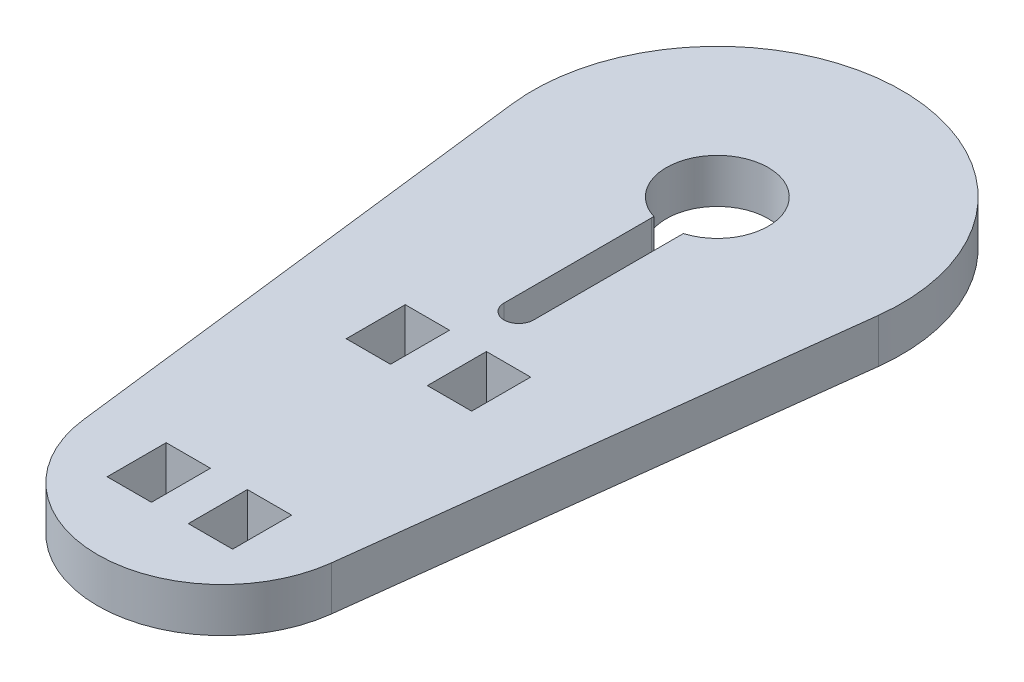
ISO-10303-21;
HEADER;
FILE_DESCRIPTION(('STEP AP214'),'2;1');
FILE_NAME('part.step','',(''),(''),'','','');
FILE_SCHEMA(('AUTOMOTIVE_DESIGN { 1 0 10303 214 1 1 1 1 }'));
ENDSEC;
DATA;
#1=APPLICATION_CONTEXT('core data for automotive mechanical design processes');
#2=APPLICATION_PROTOCOL_DEFINITION('international standard','automotive_design',2000,#1);
#3=PRODUCT_CONTEXT('',#1,'mechanical');
#4=PRODUCT('Part','Part','',(#3));
#5=PRODUCT_RELATED_PRODUCT_CATEGORY('part','',(#4));
#6=PRODUCT_DEFINITION_FORMATION('','',#4);
#7=PRODUCT_DEFINITION_CONTEXT('part definition',#1,'design');
#8=PRODUCT_DEFINITION('design','',#6,#7);
#9=PRODUCT_DEFINITION_SHAPE('','',#8);
#10=(LENGTH_UNIT() NAMED_UNIT(*) SI_UNIT(.MILLI.,.METRE.));
#11=(NAMED_UNIT(*) PLANE_ANGLE_UNIT() SI_UNIT($,.RADIAN.));
#12=(NAMED_UNIT(*) SI_UNIT($,.STERADIAN.) SOLID_ANGLE_UNIT());
#13=UNCERTAINTY_MEASURE_WITH_UNIT(LENGTH_MEASURE(1.E-05),#10,'distance_accuracy_value','');
#14=(GEOMETRIC_REPRESENTATION_CONTEXT(3) GLOBAL_UNCERTAINTY_ASSIGNED_CONTEXT((#13)) GLOBAL_UNIT_ASSIGNED_CONTEXT((#10,
#11,#12)) REPRESENTATION_CONTEXT('',''));
#15=CARTESIAN_POINT('',(0.,0.,0.));
#16=DIRECTION('',(0.,0.,1.));
#17=DIRECTION('',(1.,0.,0.));
#18=AXIS2_PLACEMENT_3D('',#15,#16,#17);
#19=CARTESIAN_POINT('',(0.,3.,33.5358925147265));
#20=DIRECTION('',(0.,-1.,0.));
#21=DIRECTION('',(0.,0.,-1.));
#22=AXIS2_PLACEMENT_3D('',#19,#20,#21);
#23=CYLINDRICAL_SURFACE('',#22,8.46410748527346);
#24=DIRECTION('',(0.,1.,0.));
#25=VECTOR('',#24,1.);
#26=CARTESIAN_POINT('',(8.40259097315382,3.,34.5545094496614));
#27=LINE('',#26,#25);
#28=CARTESIAN_POINT('',(8.40259097315382,3.,34.5545094496614));
#29=VERTEX_POINT('',#28);
#30=CARTESIAN_POINT('',(8.40259097315382,0.,34.5545094496614));
#31=VERTEX_POINT('',#30);
#32=EDGE_CURVE('E437',#29,#31,#27,.F.);
#33=ORIENTED_EDGE('',*,*,#32,.F.);
#34=CARTESIAN_POINT('',(0.,3.,33.5358925147265));
#35=DIRECTION('',(0.,1.,0.));
#36=DIRECTION('',(0.,0.,1.));
#37=AXIS2_PLACEMENT_3D('',#34,#35,#36);
#38=CIRCLE('',#37,8.46410748527346);
#39=CARTESIAN_POINT('',(-8.40259097315382,3.,34.5545094496614));
#40=VERTEX_POINT('',#39);
#41=EDGE_CURVE('E56',#40,#29,#38,.T.);
#42=ORIENTED_EDGE('',*,*,#41,.F.);
#43=DIRECTION('',(0.,-1.,0.));
#44=VECTOR('',#43,1.);
#45=CARTESIAN_POINT('',(-8.40259097315382,3.,34.5545094496614));
#46=LINE('',#45,#44);
#47=CARTESIAN_POINT('',(-8.40259097315382,0.,34.5545094496614));
#48=VERTEX_POINT('',#47);
#49=EDGE_CURVE('E499',#48,#40,#46,.F.);
#50=ORIENTED_EDGE('',*,*,#49,.F.);
#51=CARTESIAN_POINT('',(0.,0.,33.5358925147265));
#52=DIRECTION('',(0.,1.,0.));
#53=DIRECTION('',(0.,0.,1.));
#54=AXIS2_PLACEMENT_3D('',#51,#52,#53);
#55=CIRCLE('',#54,8.46410748527346);
#56=EDGE_CURVE('E12',#31,#48,#55,.F.);
#57=ORIENTED_EDGE('',*,*,#56,.F.);
#58=EDGE_LOOP('',(#33,#42,#50,#57));
#59=FACE_BOUND('',#58,.T.);
#60=ADVANCED_FACE('F47',(#59),#23,.T.);
#61=CARTESIAN_POINT('',(4.24999999999999,3.,0.));
#62=DIRECTION('',(1.,0.,0.));
#63=DIRECTION('',(0.,0.,-1.));
#64=AXIS2_PLACEMENT_3D('',#61,#62,#63);
#65=PLANE('',#64);
#66=DIRECTION('',(0.,0.,1.));
#67=VECTOR('',#66,1.);
#68=CARTESIAN_POINT('',(4.24999999999999,0.,0.));
#69=LINE('',#68,#67);
#70=CARTESIAN_POINT('',(4.25,0.,33.1));
#71=VERTEX_POINT('',#70);
#72=CARTESIAN_POINT('',(4.25,0.,37.1));
#73=VERTEX_POINT('',#72);
#74=EDGE_CURVE('E408',#71,#73,#69,.T.);
#75=ORIENTED_EDGE('',*,*,#74,.T.);
#76=DIRECTION('',(0.,-1.,0.));
#77=VECTOR('',#76,1.);
#78=CARTESIAN_POINT('',(4.25,3.,37.1));
#79=LINE('',#78,#77);
#80=CARTESIAN_POINT('',(4.25,3.,37.1));
#81=VERTEX_POINT('',#80);
#82=EDGE_CURVE('E433',#81,#73,#79,.T.);
#83=ORIENTED_EDGE('',*,*,#82,.F.);
#84=DIRECTION('',(0.,0.,1.));
#85=VECTOR('',#84,1.);
#86=CARTESIAN_POINT('',(4.24999999999999,3.,0.));
#87=LINE('',#86,#85);
#88=CARTESIAN_POINT('',(4.25,3.,33.1));
#89=VERTEX_POINT('',#88);
#90=EDGE_CURVE('E316',#89,#81,#87,.T.);
#91=ORIENTED_EDGE('',*,*,#90,.F.);
#92=DIRECTION('',(0.,-1.,0.));
#93=VECTOR('',#92,1.);
#94=CARTESIAN_POINT('',(4.25,3.,33.1));
#95=LINE('',#94,#93);
#96=EDGE_CURVE('E423',#89,#71,#95,.T.);
#97=ORIENTED_EDGE('',*,*,#96,.T.);
#98=EDGE_LOOP('',(#75,#83,#91,#97));
#99=FACE_BOUND('',#98,.T.);
#100=ADVANCED_FACE('F546',(#99),#65,.F.);
#101=CARTESIAN_POINT('',(0.,3.,37.1));
#102=DIRECTION('',(0.,0.,1.));
#103=DIRECTION('',(1.,0.,0.));
#104=AXIS2_PLACEMENT_3D('',#101,#102,#103);
#105=PLANE('',#104);
#106=DIRECTION('',(-1.,0.,0.));
#107=VECTOR('',#106,1.);
#108=CARTESIAN_POINT('',(0.,0.,37.1));
#109=LINE('',#108,#107);
#110=CARTESIAN_POINT('',(1.25,0.,37.1));
#111=VERTEX_POINT('',#110);
#112=EDGE_CURVE('E412',#73,#111,#109,.T.);
#113=ORIENTED_EDGE('',*,*,#112,.T.);
#114=DIRECTION('',(0.,-1.,0.));
#115=VECTOR('',#114,1.);
#116=CARTESIAN_POINT('',(1.25,3.,37.1));
#117=LINE('',#116,#115);
#118=CARTESIAN_POINT('',(1.25,3.,37.1));
#119=VERTEX_POINT('',#118);
#120=EDGE_CURVE('E430',#119,#111,#117,.T.);
#121=ORIENTED_EDGE('',*,*,#120,.F.);
#122=DIRECTION('',(-1.,0.,0.));
#123=VECTOR('',#122,1.);
#124=CARTESIAN_POINT('',(0.,3.,37.1));
#125=LINE('',#124,#123);
#126=EDGE_CURVE('E320',#81,#119,#125,.T.);
#127=ORIENTED_EDGE('',*,*,#126,.F.);
#128=ORIENTED_EDGE('',*,*,#82,.T.);
#129=EDGE_LOOP('',(#113,#121,#127,#128));
#130=FACE_BOUND('',#129,.T.);
#131=ADVANCED_FACE('F545',(#130),#105,.F.);
#132=CARTESIAN_POINT('',(1.25,3.,0.));
#133=DIRECTION('',(1.,0.,0.));
#134=DIRECTION('',(0.,0.,-1.));
#135=AXIS2_PLACEMENT_3D('',#132,#133,#134);
#136=PLANE('',#135);
#137=DIRECTION('',(0.,0.,1.));
#138=VECTOR('',#137,1.);
#139=CARTESIAN_POINT('',(1.25,0.,0.));
#140=LINE('',#139,#138);
#141=CARTESIAN_POINT('',(1.25,0.,33.1));
#142=VERTEX_POINT('',#141);
#143=EDGE_CURVE('E416',#142,#111,#140,.T.);
#144=ORIENTED_EDGE('',*,*,#143,.F.);
#145=DIRECTION('',(0.,-1.,0.));
#146=VECTOR('',#145,1.);
#147=CARTESIAN_POINT('',(1.25,3.,33.1));
#148=LINE('',#147,#146);
#149=CARTESIAN_POINT('',(1.25,3.,33.1));
#150=VERTEX_POINT('',#149);
#151=EDGE_CURVE('E426',#150,#142,#148,.T.);
#152=ORIENTED_EDGE('',*,*,#151,.F.);
#153=DIRECTION('',(0.,0.,1.));
#154=VECTOR('',#153,1.);
#155=CARTESIAN_POINT('',(1.25,3.,0.));
#156=LINE('',#155,#154);
#157=EDGE_CURVE('E323',#150,#119,#156,.T.);
#158=ORIENTED_EDGE('',*,*,#157,.T.);
#159=ORIENTED_EDGE('',*,*,#120,.T.);
#160=EDGE_LOOP('',(#144,#152,#158,#159));
#161=FACE_BOUND('',#160,.T.);
#162=ADVANCED_FACE('F542',(#161),#136,.T.);
#163=CARTESIAN_POINT('',(-1.25,3.,0.));
#164=DIRECTION('',(-1.,0.,0.));
#165=DIRECTION('',(0.,0.,1.));
#166=AXIS2_PLACEMENT_3D('',#163,#164,#165);
#167=PLANE('',#166);
#168=DIRECTION('',(0.,0.,-1.));
#169=VECTOR('',#168,1.);
#170=CARTESIAN_POINT('',(-1.25,0.,0.));
#171=LINE('',#170,#169);
#172=CARTESIAN_POINT('',(-1.25,0.,20.9));
#173=VERTEX_POINT('',#172);
#174=CARTESIAN_POINT('',(-1.25,0.,16.9));
#175=VERTEX_POINT('',#174);
#176=EDGE_CURVE('E392',#173,#175,#171,.T.);
#177=ORIENTED_EDGE('',*,*,#176,.F.);
#178=DIRECTION('',(0.,-1.,0.));
#179=VECTOR('',#178,1.);
#180=CARTESIAN_POINT('',(-1.25,3.,20.9));
#181=LINE('',#180,#179);
#182=CARTESIAN_POINT('',(-1.25,3.,20.9));
#183=VERTEX_POINT('',#182);
#184=EDGE_CURVE('E427',#183,#173,#181,.T.);
#185=ORIENTED_EDGE('',*,*,#184,.F.);
#186=DIRECTION('',(0.,0.,-1.));
#187=VECTOR('',#186,1.);
#188=CARTESIAN_POINT('',(-1.25,3.,0.));
#189=LINE('',#188,#187);
#190=CARTESIAN_POINT('',(-1.25,3.,16.9));
#191=VERTEX_POINT('',#190);
#192=EDGE_CURVE('E301',#183,#191,#189,.T.);
#193=ORIENTED_EDGE('',*,*,#192,.T.);
#194=DIRECTION('',(0.,-1.,0.));
#195=VECTOR('',#194,1.);
#196=CARTESIAN_POINT('',(-1.25,3.,16.9));
#197=LINE('',#196,#195);
#198=EDGE_CURVE('E438',#191,#175,#197,.T.);
#199=ORIENTED_EDGE('',*,*,#198,.T.);
#200=EDGE_LOOP('',(#177,#185,#193,#199));
#201=FACE_BOUND('',#200,.T.);
#202=ADVANCED_FACE('F580',(#201),#167,.T.);
#203=CARTESIAN_POINT('',(0.,3.,20.9));
#204=DIRECTION('',(0.,0.,-1.));
#205=DIRECTION('',(-1.,0.,0.));
#206=AXIS2_PLACEMENT_3D('',#203,#204,#205);
#207=PLANE('',#206);
#208=DIRECTION('',(1.,0.,0.));
#209=VECTOR('',#208,1.);
#210=CARTESIAN_POINT('',(0.,0.,20.9));
#211=LINE('',#210,#209);
#212=CARTESIAN_POINT('',(-4.25,0.,20.9));
#213=VERTEX_POINT('',#212);
#214=EDGE_CURVE('E396',#213,#173,#211,.T.);
#215=ORIENTED_EDGE('',*,*,#214,.F.);
#216=DIRECTION('',(0.,-1.,0.));
#217=VECTOR('',#216,1.);
#218=CARTESIAN_POINT('',(-4.25,3.,20.9));
#219=LINE('',#218,#217);
#220=CARTESIAN_POINT('',(-4.25,3.,20.9));
#221=VERTEX_POINT('',#220);
#222=EDGE_CURVE('E446',#221,#213,#219,.T.);
#223=ORIENTED_EDGE('',*,*,#222,.F.);
#224=DIRECTION('',(1.,0.,0.));
#225=VECTOR('',#224,1.);
#226=CARTESIAN_POINT('',(0.,3.,20.9));
#227=LINE('',#226,#225);
#228=EDGE_CURVE('E305',#221,#183,#227,.T.);
#229=ORIENTED_EDGE('',*,*,#228,.T.);
#230=ORIENTED_EDGE('',*,*,#184,.T.);
#231=EDGE_LOOP('',(#215,#223,#229,#230));
#232=FACE_BOUND('',#231,.T.);
#233=ADVANCED_FACE('F576',(#232),#207,.T.);
#234=CARTESIAN_POINT('',(-4.25,3.,0.));
#235=DIRECTION('',(-1.,0.,0.));
#236=DIRECTION('',(0.,0.,1.));
#237=AXIS2_PLACEMENT_3D('',#234,#235,#236);
#238=PLANE('',#237);
#239=DIRECTION('',(0.,0.,-1.));
#240=VECTOR('',#239,1.);
#241=CARTESIAN_POINT('',(-4.25,0.,0.));
#242=LINE('',#241,#240);
#243=CARTESIAN_POINT('',(-4.25,0.,16.9));
#244=VERTEX_POINT('',#243);
#245=EDGE_CURVE('E400',#213,#244,#242,.T.);
#246=ORIENTED_EDGE('',*,*,#245,.T.);
#247=DIRECTION('',(0.,-1.,0.));
#248=VECTOR('',#247,1.);
#249=CARTESIAN_POINT('',(-4.25,3.,16.9));
#250=LINE('',#249,#248);
#251=CARTESIAN_POINT('',(-4.25,3.,16.9));
#252=VERTEX_POINT('',#251);
#253=EDGE_CURVE('E441',#252,#244,#250,.T.);
#254=ORIENTED_EDGE('',*,*,#253,.F.);
#255=DIRECTION('',(0.,0.,-1.));
#256=VECTOR('',#255,1.);
#257=CARTESIAN_POINT('',(-4.25,3.,0.));
#258=LINE('',#257,#256);
#259=EDGE_CURVE('E309',#221,#252,#258,.T.);
#260=ORIENTED_EDGE('',*,*,#259,.F.);
#261=ORIENTED_EDGE('',*,*,#222,.T.);
#262=EDGE_LOOP('',(#246,#254,#260,#261));
#263=FACE_BOUND('',#262,.T.);
#264=ADVANCED_FACE('F572',(#263),#238,.F.);
#265=CARTESIAN_POINT('',(4.25,3.,0.));
#266=DIRECTION('',(-1.,0.,0.));
#267=DIRECTION('',(0.,0.,1.));
#268=AXIS2_PLACEMENT_3D('',#265,#266,#267);
#269=PLANE('',#268);
#270=DIRECTION('',(0.,0.,-1.));
#271=VECTOR('',#270,1.);
#272=CARTESIAN_POINT('',(4.25,0.,0.));
#273=LINE('',#272,#271);
#274=CARTESIAN_POINT('',(4.25,0.,20.9));
#275=VERTEX_POINT('',#274);
#276=CARTESIAN_POINT('',(4.25,0.,16.9));
#277=VERTEX_POINT('',#276);
#278=EDGE_CURVE('E376',#275,#277,#273,.T.);
#279=ORIENTED_EDGE('',*,*,#278,.F.);
#280=DIRECTION('',(0.,-1.,0.));
#281=VECTOR('',#280,1.);
#282=CARTESIAN_POINT('',(4.25,3.,20.9));
#283=LINE('',#282,#281);
#284=CARTESIAN_POINT('',(4.25,3.,20.9));
#285=VERTEX_POINT('',#284);
#286=EDGE_CURVE('E442',#285,#275,#283,.T.);
#287=ORIENTED_EDGE('',*,*,#286,.F.);
#288=DIRECTION('',(0.,0.,-1.));
#289=VECTOR('',#288,1.);
#290=CARTESIAN_POINT('',(4.25,3.,0.));
#291=LINE('',#290,#289);
#292=CARTESIAN_POINT('',(4.25,3.,16.9));
#293=VERTEX_POINT('',#292);
#294=EDGE_CURVE('E286',#285,#293,#291,.T.);
#295=ORIENTED_EDGE('',*,*,#294,.T.);
#296=DIRECTION('',(0.,-1.,0.));
#297=VECTOR('',#296,1.);
#298=CARTESIAN_POINT('',(4.25,3.,16.9));
#299=LINE('',#298,#297);
#300=EDGE_CURVE('E451',#293,#277,#299,.T.);
#301=ORIENTED_EDGE('',*,*,#300,.T.);
#302=EDGE_LOOP('',(#279,#287,#295,#301));
#303=FACE_BOUND('',#302,.T.);
#304=ADVANCED_FACE('F575',(#303),#269,.T.);
#305=CARTESIAN_POINT('',(0.,3.,20.9));
#306=DIRECTION('',(0.,0.,1.));
#307=DIRECTION('',(1.,0.,0.));
#308=AXIS2_PLACEMENT_3D('',#305,#306,#307);
#309=PLANE('',#308);
#310=DIRECTION('',(-1.,0.,0.));
#311=VECTOR('',#310,1.);
#312=CARTESIAN_POINT('',(0.,0.,20.9));
#313=LINE('',#312,#311);
#314=CARTESIAN_POINT('',(1.25,0.,20.9));
#315=VERTEX_POINT('',#314);
#316=EDGE_CURVE('E380',#275,#315,#313,.T.);
#317=ORIENTED_EDGE('',*,*,#316,.T.);
#318=DIRECTION('',(0.,-1.,0.));
#319=VECTOR('',#318,1.);
#320=CARTESIAN_POINT('',(1.25,3.,20.9));
#321=LINE('',#320,#319);
#322=CARTESIAN_POINT('',(1.25,3.,20.9));
#323=VERTEX_POINT('',#322);
#324=EDGE_CURVE('E458',#323,#315,#321,.T.);
#325=ORIENTED_EDGE('',*,*,#324,.F.);
#326=DIRECTION('',(-1.,0.,0.));
#327=VECTOR('',#326,1.);
#328=CARTESIAN_POINT('',(0.,3.,20.9));
#329=LINE('',#328,#327);
#330=EDGE_CURVE('E290',#285,#323,#329,.T.);
#331=ORIENTED_EDGE('',*,*,#330,.F.);
#332=ORIENTED_EDGE('',*,*,#286,.T.);
#333=EDGE_LOOP('',(#317,#325,#331,#332));
#334=FACE_BOUND('',#333,.T.);
#335=ADVANCED_FACE('F593',(#334),#309,.F.);
#336=CARTESIAN_POINT('',(1.25,3.,0.));
#337=DIRECTION('',(-1.,0.,0.));
#338=DIRECTION('',(0.,0.,1.));
#339=AXIS2_PLACEMENT_3D('',#336,#337,#338);
#340=PLANE('',#339);
#341=DIRECTION('',(0.,0.,-1.));
#342=VECTOR('',#341,1.);
#343=CARTESIAN_POINT('',(1.25,0.,0.));
#344=LINE('',#343,#342);
#345=CARTESIAN_POINT('',(1.25,0.,16.9));
#346=VERTEX_POINT('',#345);
#347=EDGE_CURVE('E384',#315,#346,#344,.T.);
#348=ORIENTED_EDGE('',*,*,#347,.T.);
#349=DIRECTION('',(0.,-1.,0.));
#350=VECTOR('',#349,1.);
#351=CARTESIAN_POINT('',(1.25,3.,16.9));
#352=LINE('',#351,#350);
#353=CARTESIAN_POINT('',(1.25,3.,16.9));
#354=VERTEX_POINT('',#353);
#355=EDGE_CURVE('E454',#354,#346,#352,.T.);
#356=ORIENTED_EDGE('',*,*,#355,.F.);
#357=DIRECTION('',(0.,0.,-1.));
#358=VECTOR('',#357,1.);
#359=CARTESIAN_POINT('',(1.25,3.,0.));
#360=LINE('',#359,#358);
#361=EDGE_CURVE('E294',#323,#354,#360,.T.);
#362=ORIENTED_EDGE('',*,*,#361,.F.);
#363=ORIENTED_EDGE('',*,*,#324,.T.);
#364=EDGE_LOOP('',(#348,#356,#362,#363));
#365=FACE_BOUND('',#364,.T.);
#366=ADVANCED_FACE('F589',(#365),#340,.F.);
#367=CARTESIAN_POINT('',(-4.24999999999999,3.,0.));
#368=DIRECTION('',(1.,0.,0.));
#369=DIRECTION('',(0.,0.,-1.));
#370=AXIS2_PLACEMENT_3D('',#367,#368,#369);
#371=PLANE('',#370);
#372=DIRECTION('',(0.,0.,1.));
#373=VECTOR('',#372,1.);
#374=CARTESIAN_POINT('',(-4.24999999999999,0.,0.));
#375=LINE('',#374,#373);
#376=CARTESIAN_POINT('',(-4.25,0.,33.1));
#377=VERTEX_POINT('',#376);
#378=CARTESIAN_POINT('',(-4.25,0.,37.1));
#379=VERTEX_POINT('',#378);
#380=EDGE_CURVE('E360',#377,#379,#375,.T.);
#381=ORIENTED_EDGE('',*,*,#380,.F.);
#382=DIRECTION('',(0.,-1.,0.));
#383=VECTOR('',#382,1.);
#384=CARTESIAN_POINT('',(-4.25,3.,33.1));
#385=LINE('',#384,#383);
#386=CARTESIAN_POINT('',(-4.25,3.,33.1));
#387=VERTEX_POINT('',#386);
#388=EDGE_CURVE('E455',#387,#377,#385,.T.);
#389=ORIENTED_EDGE('',*,*,#388,.F.);
#390=DIRECTION('',(0.,0.,1.));
#391=VECTOR('',#390,1.);
#392=CARTESIAN_POINT('',(-4.24999999999999,3.,0.));
#393=LINE('',#392,#391);
#394=CARTESIAN_POINT('',(-4.25,3.,37.1));
#395=VERTEX_POINT('',#394);
#396=EDGE_CURVE('E271',#387,#395,#393,.T.);
#397=ORIENTED_EDGE('',*,*,#396,.T.);
#398=DIRECTION('',(0.,-1.,0.));
#399=VECTOR('',#398,1.);
#400=CARTESIAN_POINT('',(-4.25,3.,37.1));
#401=LINE('',#400,#399);
#402=EDGE_CURVE('E464',#395,#379,#401,.T.);
#403=ORIENTED_EDGE('',*,*,#402,.T.);
#404=EDGE_LOOP('',(#381,#389,#397,#403));
#405=FACE_BOUND('',#404,.T.);
#406=ADVANCED_FACE('F592',(#405),#371,.T.);
#407=CARTESIAN_POINT('',(0.,3.,33.1));
#408=DIRECTION('',(0.,0.,-1.));
#409=DIRECTION('',(-1.,0.,0.));
#410=AXIS2_PLACEMENT_3D('',#407,#408,#409);
#411=PLANE('',#410);
#412=DIRECTION('',(1.,0.,0.));
#413=VECTOR('',#412,1.);
#414=CARTESIAN_POINT('',(0.,0.,33.1));
#415=LINE('',#414,#413);
#416=CARTESIAN_POINT('',(-1.25,0.,33.1));
#417=VERTEX_POINT('',#416);
#418=EDGE_CURVE('E364',#377,#417,#415,.T.);
#419=ORIENTED_EDGE('',*,*,#418,.T.);
#420=DIRECTION('',(0.,-1.,0.));
#421=VECTOR('',#420,1.);
#422=CARTESIAN_POINT('',(-1.25,3.,33.1));
#423=LINE('',#422,#421);
#424=CARTESIAN_POINT('',(-1.25,3.,33.1));
#425=VERTEX_POINT('',#424);
#426=EDGE_CURVE('E471',#425,#417,#423,.T.);
#427=ORIENTED_EDGE('',*,*,#426,.F.);
#428=DIRECTION('',(1.,0.,0.));
#429=VECTOR('',#428,1.);
#430=CARTESIAN_POINT('',(0.,3.,33.1));
#431=LINE('',#430,#429);
#432=EDGE_CURVE('E275',#387,#425,#431,.T.);
#433=ORIENTED_EDGE('',*,*,#432,.F.);
#434=ORIENTED_EDGE('',*,*,#388,.T.);
#435=EDGE_LOOP('',(#419,#427,#433,#434));
#436=FACE_BOUND('',#435,.T.);
#437=ADVANCED_FACE('F607',(#436),#411,.F.);
#438=CARTESIAN_POINT('',(-1.25,3.,0.));
#439=DIRECTION('',(1.,0.,0.));
#440=DIRECTION('',(0.,0.,-1.));
#441=AXIS2_PLACEMENT_3D('',#438,#439,#440);
#442=PLANE('',#441);
#443=DIRECTION('',(0.,0.,1.));
#444=VECTOR('',#443,1.);
#445=CARTESIAN_POINT('',(-1.25,0.,0.));
#446=LINE('',#445,#444);
#447=CARTESIAN_POINT('',(-1.25,0.,37.1));
#448=VERTEX_POINT('',#447);
#449=EDGE_CURVE('E368',#417,#448,#446,.T.);
#450=ORIENTED_EDGE('',*,*,#449,.T.);
#451=DIRECTION('',(0.,-1.,0.));
#452=VECTOR('',#451,1.);
#453=CARTESIAN_POINT('',(-1.25,3.,37.1));
#454=LINE('',#453,#452);
#455=CARTESIAN_POINT('',(-1.25,3.,37.1));
#456=VERTEX_POINT('',#455);
#457=EDGE_CURVE('E467',#456,#448,#454,.T.);
#458=ORIENTED_EDGE('',*,*,#457,.F.);
#459=DIRECTION('',(0.,0.,1.));
#460=VECTOR('',#459,1.);
#461=CARTESIAN_POINT('',(-1.25,3.,0.));
#462=LINE('',#461,#460);
#463=EDGE_CURVE('E279',#425,#456,#462,.T.);
#464=ORIENTED_EDGE('',*,*,#463,.F.);
#465=ORIENTED_EDGE('',*,*,#426,.T.);
#466=EDGE_LOOP('',(#450,#458,#464,#465));
#467=FACE_BOUND('',#466,.T.);
#468=ADVANCED_FACE('F604',(#467),#442,.F.);
#469=CARTESIAN_POINT('',(12.409150917231,3.,1.5043182885897));
#470=DIRECTION('',(-0.992732073378479,0.,-0.120345463087176));
#471=DIRECTION('',(-0.120345463087176,0.,0.992732073378479));
#472=AXIS2_PLACEMENT_3D('',#469,#470,#471);
#473=PLANE('',#472);
#474=DIRECTION('',(0.120345463087176,0.,-0.992732073378479));
#475=VECTOR('',#474,1.);
#476=CARTESIAN_POINT('',(12.409150917231,3.,1.5043182885897));
#477=LINE('',#476,#475);
#478=CARTESIAN_POINT('',(12.409150917231,3.,1.50431828858971));
#479=VERTEX_POINT('',#478);
#480=EDGE_CURVE('E261',#29,#479,#477,.T.);
#481=ORIENTED_EDGE('',*,*,#480,.F.);
#482=ORIENTED_EDGE('',*,*,#32,.T.);
#483=DIRECTION('',(0.120345463087176,0.,-0.992732073378479));
#484=VECTOR('',#483,1.);
#485=CARTESIAN_POINT('',(12.409150917231,0.,1.5043182885897));
#486=LINE('',#485,#484);
#487=CARTESIAN_POINT('',(12.409150917231,0.,1.50431828858971));
#488=VERTEX_POINT('',#487);
#489=EDGE_CURVE('E350',#31,#488,#486,.T.);
#490=ORIENTED_EDGE('',*,*,#489,.T.);
#491=DIRECTION('',(0.,-1.,0.));
#492=VECTOR('',#491,1.);
#493=CARTESIAN_POINT('',(12.409150917231,3.,1.50431828858971));
#494=LINE('',#493,#492);
#495=EDGE_CURVE('E468',#479,#488,#494,.T.);
#496=ORIENTED_EDGE('',*,*,#495,.F.);
#497=EDGE_LOOP('',(#481,#482,#490,#496));
#498=FACE_BOUND('',#497,.T.);
#499=ADVANCED_FACE('F508',(#498),#473,.F.);
#500=CARTESIAN_POINT('',(0.,3.,0.));
#501=DIRECTION('',(0.,-1.,0.));
#502=DIRECTION('',(0.,0.,-1.));
#503=AXIS2_PLACEMENT_3D('',#500,#501,#502);
#504=CYLINDRICAL_SURFACE('',#503,12.5);
#505=CARTESIAN_POINT('',(0.,0.,0.));
#506=DIRECTION('',(0.,1.,0.));
#507=DIRECTION('',(0.,0.,1.));
#508=AXIS2_PLACEMENT_3D('',#505,#506,#507);
#509=CIRCLE('',#508,12.5);
#510=CARTESIAN_POINT('',(-12.409150917231,0.,1.50431828858971));
#511=VERTEX_POINT('',#510);
#512=EDGE_CURVE('E353',#488,#511,#509,.T.);
#513=ORIENTED_EDGE('',*,*,#512,.T.);
#514=DIRECTION('',(0.,-1.,0.));
#515=VECTOR('',#514,1.);
#516=CARTESIAN_POINT('',(-12.409150917231,3.,1.50431828858971));
#517=LINE('',#516,#515);
#518=CARTESIAN_POINT('',(-12.409150917231,3.,1.50431828858971));
#519=VERTEX_POINT('',#518);
#520=EDGE_CURVE('E243',#519,#511,#517,.T.);
#521=ORIENTED_EDGE('',*,*,#520,.F.);
#522=CARTESIAN_POINT('',(0.,3.,0.));
#523=DIRECTION('',(0.,1.,0.));
#524=DIRECTION('',(0.,0.,1.));
#525=AXIS2_PLACEMENT_3D('',#522,#523,#524);
#526=CIRCLE('',#525,12.5);
#527=EDGE_CURVE('E264',#479,#519,#526,.T.);
#528=ORIENTED_EDGE('',*,*,#527,.F.);
#529=ORIENTED_EDGE('',*,*,#495,.T.);
#530=EDGE_LOOP('',(#513,#521,#528,#529));
#531=FACE_BOUND('',#530,.T.);
#532=ADVANCED_FACE('F511',(#531),#504,.T.);
#533=CARTESIAN_POINT('',(1.,3.,0.));
#534=DIRECTION('',(1.,0.,0.));
#535=DIRECTION('',(0.,0.,-1.));
#536=AXIS2_PLACEMENT_3D('',#533,#534,#535);
#537=PLANE('',#536);
#538=DIRECTION('',(0.,0.,1.));
#539=VECTOR('',#538,1.);
#540=CARTESIAN_POINT('',(1.,0.,0.));
#541=LINE('',#540,#539);
#542=CARTESIAN_POINT('',(1.,0.,3.45));
#543=VERTEX_POINT('',#542);
#544=CARTESIAN_POINT('',(1.,0.,13.45));
#545=VERTEX_POINT('',#544);
#546=EDGE_CURVE('E238',#543,#545,#541,.T.);
#547=ORIENTED_EDGE('',*,*,#546,.T.);
#548=DIRECTION('',(0.,-1.,0.));
#549=VECTOR('',#548,1.);
#550=CARTESIAN_POINT('',(1.,3.,13.45));
#551=LINE('',#550,#549);
#552=CARTESIAN_POINT('',(1.,3.,13.45));
#553=VERTEX_POINT('',#552);
#554=EDGE_CURVE('E235',#553,#545,#551,.T.);
#555=ORIENTED_EDGE('',*,*,#554,.F.);
#556=DIRECTION('',(0.,0.,1.));
#557=VECTOR('',#556,1.);
#558=CARTESIAN_POINT('',(1.,3.,0.));
#559=LINE('',#558,#557);
#560=CARTESIAN_POINT('',(1.,3.,3.45));
#561=VERTEX_POINT('',#560);
#562=EDGE_CURVE('E219',#561,#553,#559,.T.);
#563=ORIENTED_EDGE('',*,*,#562,.F.);
#564=DIRECTION('',(0.,-1.,0.));
#565=VECTOR('',#564,1.);
#566=CARTESIAN_POINT('',(1.,3.,3.45));
#567=LINE('',#566,#565);
#568=EDGE_CURVE('E331',#561,#543,#567,.T.);
#569=ORIENTED_EDGE('',*,*,#568,.T.);
#570=EDGE_LOOP('',(#547,#555,#563,#569));
#571=FACE_BOUND('',#570,.T.);
#572=ADVANCED_FACE('F236',(#571),#537,.F.);
#573=CARTESIAN_POINT('',(0.,3.,13.45));
#574=DIRECTION('',(0.,-1.,0.));
#575=DIRECTION('',(0.,0.,-1.));
#576=AXIS2_PLACEMENT_3D('',#573,#574,#575);
#577=CYLINDRICAL_SURFACE('',#576,1.);
#578=CARTESIAN_POINT('',(0.,0.,13.45));
#579=DIRECTION('',(0.,1.,0.));
#580=DIRECTION('',(0.,0.,1.));
#581=AXIS2_PLACEMENT_3D('',#578,#579,#580);
#582=CIRCLE('',#581,1.);
#583=CARTESIAN_POINT('',(-1.,0.,13.45));
#584=VERTEX_POINT('',#583);
#585=EDGE_CURVE('E334',#584,#545,#582,.T.);
#586=ORIENTED_EDGE('',*,*,#585,.F.);
#587=DIRECTION('',(0.,-1.,0.));
#588=VECTOR('',#587,1.);
#589=CARTESIAN_POINT('',(-1.,3.,13.45));
#590=LINE('',#589,#588);
#591=CARTESIAN_POINT('',(-1.,3.,13.45));
#592=VERTEX_POINT('',#591);
#593=EDGE_CURVE('E244',#592,#584,#590,.T.);
#594=ORIENTED_EDGE('',*,*,#593,.F.);
#595=CARTESIAN_POINT('',(0.,3.,13.45));
#596=DIRECTION('',(0.,1.,0.));
#597=DIRECTION('',(0.,0.,1.));
#598=AXIS2_PLACEMENT_3D('',#595,#596,#597);
#599=CIRCLE('',#598,1.);
#600=EDGE_CURVE('E225',#592,#553,#599,.T.);
#601=ORIENTED_EDGE('',*,*,#600,.T.);
#602=ORIENTED_EDGE('',*,*,#554,.T.);
#603=EDGE_LOOP('',(#586,#594,#601,#602));
#604=FACE_BOUND('',#603,.T.);
#605=ADVANCED_FACE('F246',(#604),#577,.F.);
#606=CARTESIAN_POINT('',(-1.,3.,0.));
#607=DIRECTION('',(1.,0.,0.));
#608=DIRECTION('',(0.,0.,-1.));
#609=AXIS2_PLACEMENT_3D('',#606,#607,#608);
#610=PLANE('',#609);
#611=DIRECTION('',(0.,0.,1.));
#612=VECTOR('',#611,1.);
#613=CARTESIAN_POINT('',(-1.,0.,0.));
#614=LINE('',#613,#612);
#615=CARTESIAN_POINT('',(-1.,0.,3.45));
#616=VERTEX_POINT('',#615);
#617=EDGE_CURVE('E337',#616,#584,#614,.T.);
#618=ORIENTED_EDGE('',*,*,#617,.F.);
#619=DIRECTION('',(0.,-1.,0.));
#620=VECTOR('',#619,1.);
#621=CARTESIAN_POINT('',(-1.,3.,3.45));
#622=LINE('',#621,#620);
#623=CARTESIAN_POINT('',(-1.,3.,3.45));
#624=VERTEX_POINT('',#623);
#625=EDGE_CURVE('E491',#624,#616,#622,.T.);
#626=ORIENTED_EDGE('',*,*,#625,.F.);
#627=DIRECTION('',(0.,0.,1.));
#628=VECTOR('',#627,1.);
#629=CARTESIAN_POINT('',(-1.,3.,0.));
#630=LINE('',#629,#628);
#631=EDGE_CURVE('E248',#624,#592,#630,.T.);
#632=ORIENTED_EDGE('',*,*,#631,.T.);
#633=ORIENTED_EDGE('',*,*,#593,.T.);
#634=EDGE_LOOP('',(#618,#626,#632,#633));
#635=FACE_BOUND('',#634,.T.);
#636=ADVANCED_FACE('F628',(#635),#610,.T.);
#637=CARTESIAN_POINT('',(0.,3.,3.45));
#638=DIRECTION('',(0.,-1.,0.));
#639=DIRECTION('',(0.,0.,-1.));
#640=AXIS2_PLACEMENT_3D('',#637,#638,#639);
#641=CYLINDRICAL_SURFACE('',#640,1.);
#642=CARTESIAN_POINT('',(0.,0.,3.45));
#643=DIRECTION('',(0.,1.,0.));
#644=DIRECTION('',(0.,0.,1.));
#645=AXIS2_PLACEMENT_3D('',#642,#643,#644);
#646=CIRCLE('',#645,1.);
#647=CARTESIAN_POINT('',(-0.989442271808596,0.,3.30507246376812));
#648=VERTEX_POINT('',#647);
#649=EDGE_CURVE('E341',#648,#616,#646,.T.);
#650=ORIENTED_EDGE('',*,*,#649,.F.);
#651=DIRECTION('',(0.,-1.,0.));
#652=VECTOR('',#651,1.);
#653=CARTESIAN_POINT('',(-0.989442271808596,3.,3.30507246376812));
#654=LINE('',#653,#652);
#655=CARTESIAN_POINT('',(-0.989442271808596,3.,3.30507246376812));
#656=VERTEX_POINT('',#655);
#657=EDGE_CURVE('E488',#656,#648,#654,.T.);
#658=ORIENTED_EDGE('',*,*,#657,.F.);
#659=CARTESIAN_POINT('',(0.,3.,3.45));
#660=DIRECTION('',(0.,1.,0.));
#661=DIRECTION('',(0.,0.,1.));
#662=AXIS2_PLACEMENT_3D('',#659,#660,#661);
#663=CIRCLE('',#662,1.);
#664=EDGE_CURVE('E251',#656,#624,#663,.T.);
#665=ORIENTED_EDGE('',*,*,#664,.T.);
#666=ORIENTED_EDGE('',*,*,#625,.T.);
#667=EDGE_LOOP('',(#650,#658,#665,#666));
#668=FACE_BOUND('',#667,.T.);
#669=ADVANCED_FACE('F624',(#668),#641,.F.);
#670=CARTESIAN_POINT('',(0.,3.,0.));
#671=DIRECTION('',(0.,-1.,0.));
#672=DIRECTION('',(0.,0.,-1.));
#673=AXIS2_PLACEMENT_3D('',#670,#671,#672);
#674=CYLINDRICAL_SURFACE('',#673,3.45);
#675=CARTESIAN_POINT('',(0.,0.,0.));
#676=DIRECTION('',(0.,1.,0.));
#677=DIRECTION('',(0.,0.,1.));
#678=AXIS2_PLACEMENT_3D('',#675,#676,#677);
#679=CIRCLE('',#678,3.45);
#680=CARTESIAN_POINT('',(0.989442271808596,0.,3.30507246376812));
#681=VERTEX_POINT('',#680);
#682=EDGE_CURVE('E345',#681,#648,#679,.T.);
#683=ORIENTED_EDGE('',*,*,#682,.F.);
#684=DIRECTION('',(0.,-1.,0.));
#685=VECTOR('',#684,1.);
#686=CARTESIAN_POINT('',(0.989442271808596,3.,3.30507246376812));
#687=LINE('',#686,#685);
#688=CARTESIAN_POINT('',(0.989442271808596,3.,3.30507246376812));
#689=VERTEX_POINT('',#688);
#690=EDGE_CURVE('E485',#689,#681,#687,.T.);
#691=ORIENTED_EDGE('',*,*,#690,.F.);
#692=CARTESIAN_POINT('',(0.,3.,0.));
#693=DIRECTION('',(0.,1.,0.));
#694=DIRECTION('',(0.,0.,1.));
#695=AXIS2_PLACEMENT_3D('',#692,#693,#694);
#696=CIRCLE('',#695,3.45);
#697=EDGE_CURVE('E257',#689,#656,#696,.T.);
#698=ORIENTED_EDGE('',*,*,#697,.T.);
#699=ORIENTED_EDGE('',*,*,#657,.T.);
#700=EDGE_LOOP('',(#683,#691,#698,#699));
#701=FACE_BOUND('',#700,.T.);
#702=ADVANCED_FACE('F570',(#701),#674,.F.);
#703=CARTESIAN_POINT('',(0.,3.,16.9));
#704=DIRECTION('',(0.,0.,-1.));
#705=DIRECTION('',(-1.,0.,0.));
#706=AXIS2_PLACEMENT_3D('',#703,#704,#705);
#707=PLANE('',#706);
#708=DIRECTION('',(1.,0.,0.));
#709=VECTOR('',#708,1.);
#710=CARTESIAN_POINT('',(0.,0.,16.9));
#711=LINE('',#710,#709);
#712=EDGE_CURVE('E404',#244,#175,#711,.T.);
#713=ORIENTED_EDGE('',*,*,#712,.T.);
#714=ORIENTED_EDGE('',*,*,#198,.F.);
#715=DIRECTION('',(1.,0.,0.));
#716=VECTOR('',#715,1.);
#717=CARTESIAN_POINT('',(0.,3.,16.9));
#718=LINE('',#717,#716);
#719=EDGE_CURVE('E313',#252,#191,#718,.T.);
#720=ORIENTED_EDGE('',*,*,#719,.F.);
#721=ORIENTED_EDGE('',*,*,#253,.T.);
#722=EDGE_LOOP('',(#713,#714,#720,#721));
#723=FACE_BOUND('',#722,.T.);
#724=ADVANCED_FACE('F566',(#723),#707,.F.);
#725=CARTESIAN_POINT('',(0.,3.,16.9));
#726=DIRECTION('',(0.,0.,1.));
#727=DIRECTION('',(1.,0.,0.));
#728=AXIS2_PLACEMENT_3D('',#725,#726,#727);
#729=PLANE('',#728);
#730=DIRECTION('',(-1.,0.,0.));
#731=VECTOR('',#730,1.);
#732=CARTESIAN_POINT('',(0.,0.,16.9));
#733=LINE('',#732,#731);
#734=EDGE_CURVE('E388',#277,#346,#733,.T.);
#735=ORIENTED_EDGE('',*,*,#734,.F.);
#736=ORIENTED_EDGE('',*,*,#300,.F.);
#737=DIRECTION('',(-1.,0.,0.));
#738=VECTOR('',#737,1.);
#739=CARTESIAN_POINT('',(0.,3.,16.9));
#740=LINE('',#739,#738);
#741=EDGE_CURVE('E297',#293,#354,#740,.T.);
#742=ORIENTED_EDGE('',*,*,#741,.T.);
#743=ORIENTED_EDGE('',*,*,#355,.T.);
#744=EDGE_LOOP('',(#735,#736,#742,#743));
#745=FACE_BOUND('',#744,.T.);
#746=ADVANCED_FACE('F569',(#745),#729,.T.);
#747=CARTESIAN_POINT('',(0.,3.,37.1));
#748=DIRECTION('',(0.,0.,-1.));
#749=DIRECTION('',(-1.,0.,0.));
#750=AXIS2_PLACEMENT_3D('',#747,#748,#749);
#751=PLANE('',#750);
#752=DIRECTION('',(1.,0.,0.));
#753=VECTOR('',#752,1.);
#754=CARTESIAN_POINT('',(0.,0.,37.1));
#755=LINE('',#754,#753);
#756=EDGE_CURVE('E372',#379,#448,#755,.T.);
#757=ORIENTED_EDGE('',*,*,#756,.F.);
#758=ORIENTED_EDGE('',*,*,#402,.F.);
#759=DIRECTION('',(1.,0.,0.));
#760=VECTOR('',#759,1.);
#761=CARTESIAN_POINT('',(0.,3.,37.1));
#762=LINE('',#761,#760);
#763=EDGE_CURVE('E282',#395,#456,#762,.T.);
#764=ORIENTED_EDGE('',*,*,#763,.T.);
#765=ORIENTED_EDGE('',*,*,#457,.T.);
#766=EDGE_LOOP('',(#757,#758,#764,#765));
#767=FACE_BOUND('',#766,.T.);
#768=ADVANCED_FACE('F587',(#767),#751,.T.);
#769=CARTESIAN_POINT('',(-12.409150917231,3.,1.5043182885897));
#770=DIRECTION('',(-0.992732073378479,0.,0.120345463087176));
#771=DIRECTION('',(0.120345463087176,0.,0.992732073378479));
#772=AXIS2_PLACEMENT_3D('',#769,#770,#771);
#773=PLANE('',#772);
#774=DIRECTION('',(-0.120345463087176,0.,-0.992732073378479));
#775=VECTOR('',#774,1.);
#776=CARTESIAN_POINT('',(-12.409150917231,0.,1.5043182885897));
#777=LINE('',#776,#775);
#778=EDGE_CURVE('E357',#48,#511,#777,.T.);
#779=ORIENTED_EDGE('',*,*,#778,.F.);
#780=ORIENTED_EDGE('',*,*,#49,.T.);
#781=DIRECTION('',(-0.120345463087176,0.,-0.992732073378479));
#782=VECTOR('',#781,1.);
#783=CARTESIAN_POINT('',(-12.409150917231,3.,1.5043182885897));
#784=LINE('',#783,#782);
#785=EDGE_CURVE('E268',#40,#519,#784,.T.);
#786=ORIENTED_EDGE('',*,*,#785,.T.);
#787=ORIENTED_EDGE('',*,*,#520,.T.);
#788=EDGE_LOOP('',(#779,#780,#786,#787));
#789=FACE_BOUND('',#788,.T.);
#790=ADVANCED_FACE('F515',(#789),#773,.T.);
#791=EDGE_CURVE('E346',#543,#681,#646,.T.);
#792=ORIENTED_EDGE('',*,*,#791,.F.);
#793=ORIENTED_EDGE('',*,*,#568,.F.);
#794=EDGE_CURVE('E229',#561,#689,#663,.T.);
#795=ORIENTED_EDGE('',*,*,#794,.T.);
#796=ORIENTED_EDGE('',*,*,#690,.T.);
#797=EDGE_LOOP('',(#792,#793,#795,#796));
#798=FACE_BOUND('',#797,.T.);
#799=ADVANCED_FACE('F553',(#798),#641,.F.);
#800=CARTESIAN_POINT('',(0.,3.,33.1));
#801=DIRECTION('',(0.,0.,1.));
#802=DIRECTION('',(1.,0.,0.));
#803=AXIS2_PLACEMENT_3D('',#800,#801,#802);
#804=PLANE('',#803);
#805=DIRECTION('',(-1.,0.,0.));
#806=VECTOR('',#805,1.);
#807=CARTESIAN_POINT('',(0.,0.,33.1));
#808=LINE('',#807,#806);
#809=EDGE_CURVE('E232',#71,#142,#808,.T.);
#810=ORIENTED_EDGE('',*,*,#809,.F.);
#811=ORIENTED_EDGE('',*,*,#96,.F.);
#812=DIRECTION('',(-1.,0.,0.));
#813=VECTOR('',#812,1.);
#814=CARTESIAN_POINT('',(0.,3.,33.1));
#815=LINE('',#814,#813);
#816=EDGE_CURVE('E327',#89,#150,#815,.T.);
#817=ORIENTED_EDGE('',*,*,#816,.T.);
#818=ORIENTED_EDGE('',*,*,#151,.T.);
#819=EDGE_LOOP('',(#810,#811,#817,#818));
#820=FACE_BOUND('',#819,.T.);
#821=ADVANCED_FACE('F536',(#820),#804,.T.);
#822=CARTESIAN_POINT('',(0.,3.,0.));
#823=DIRECTION('',(0.,1.,0.));
#824=DIRECTION('',(0.,0.,1.));
#825=AXIS2_PLACEMENT_3D('',#822,#823,#824);
#826=PLANE('',#825);
#827=ORIENTED_EDGE('',*,*,#562,.T.);
#828=ORIENTED_EDGE('',*,*,#600,.F.);
#829=ORIENTED_EDGE('',*,*,#631,.F.);
#830=ORIENTED_EDGE('',*,*,#664,.F.);
#831=ORIENTED_EDGE('',*,*,#697,.F.);
#832=ORIENTED_EDGE('',*,*,#794,.F.);
#833=EDGE_LOOP('',(#827,#828,#829,#830,#831,#832));
#834=FACE_BOUND('',#833,.T.);
#835=ORIENTED_EDGE('',*,*,#785,.F.);
#836=ORIENTED_EDGE('',*,*,#41,.T.);
#837=ORIENTED_EDGE('',*,*,#480,.T.);
#838=ORIENTED_EDGE('',*,*,#527,.T.);
#839=EDGE_LOOP('',(#835,#836,#837,#838));
#840=FACE_BOUND('',#839,.T.);
#841=ORIENTED_EDGE('',*,*,#396,.F.);
#842=ORIENTED_EDGE('',*,*,#432,.T.);
#843=ORIENTED_EDGE('',*,*,#463,.T.);
#844=ORIENTED_EDGE('',*,*,#763,.F.);
#845=EDGE_LOOP('',(#841,#842,#843,#844));
#846=FACE_BOUND('',#845,.T.);
#847=ORIENTED_EDGE('',*,*,#294,.F.);
#848=ORIENTED_EDGE('',*,*,#330,.T.);
#849=ORIENTED_EDGE('',*,*,#361,.T.);
#850=ORIENTED_EDGE('',*,*,#741,.F.);
#851=EDGE_LOOP('',(#847,#848,#849,#850));
#852=FACE_BOUND('',#851,.T.);
#853=ORIENTED_EDGE('',*,*,#192,.F.);
#854=ORIENTED_EDGE('',*,*,#228,.F.);
#855=ORIENTED_EDGE('',*,*,#259,.T.);
#856=ORIENTED_EDGE('',*,*,#719,.T.);
#857=EDGE_LOOP('',(#853,#854,#855,#856));
#858=FACE_BOUND('',#857,.T.);
#859=ORIENTED_EDGE('',*,*,#90,.T.);
#860=ORIENTED_EDGE('',*,*,#126,.T.);
#861=ORIENTED_EDGE('',*,*,#157,.F.);
#862=ORIENTED_EDGE('',*,*,#816,.F.);
#863=EDGE_LOOP('',(#859,#860,#861,#862));
#864=FACE_BOUND('',#863,.T.);
#865=ADVANCED_FACE('F221',(#834,#840,#846,#852,#858,#864),#826,.T.);
#866=CARTESIAN_POINT('',(0.,0.,0.));
#867=DIRECTION('',(0.,1.,0.));
#868=DIRECTION('',(0.,0.,1.));
#869=AXIS2_PLACEMENT_3D('',#866,#867,#868);
#870=PLANE('',#869);
#871=ORIENTED_EDGE('',*,*,#546,.F.);
#872=ORIENTED_EDGE('',*,*,#791,.T.);
#873=ORIENTED_EDGE('',*,*,#682,.T.);
#874=ORIENTED_EDGE('',*,*,#649,.T.);
#875=ORIENTED_EDGE('',*,*,#617,.T.);
#876=ORIENTED_EDGE('',*,*,#585,.T.);
#877=EDGE_LOOP('',(#871,#872,#873,#874,#875,#876));
#878=FACE_BOUND('',#877,.T.);
#879=ORIENTED_EDGE('',*,*,#489,.F.);
#880=ORIENTED_EDGE('',*,*,#56,.T.);
#881=ORIENTED_EDGE('',*,*,#778,.T.);
#882=ORIENTED_EDGE('',*,*,#512,.F.);
#883=EDGE_LOOP('',(#879,#880,#881,#882));
#884=FACE_BOUND('',#883,.T.);
#885=ORIENTED_EDGE('',*,*,#380,.T.);
#886=ORIENTED_EDGE('',*,*,#756,.T.);
#887=ORIENTED_EDGE('',*,*,#449,.F.);
#888=ORIENTED_EDGE('',*,*,#418,.F.);
#889=EDGE_LOOP('',(#885,#886,#887,#888));
#890=FACE_BOUND('',#889,.T.);
#891=ORIENTED_EDGE('',*,*,#278,.T.);
#892=ORIENTED_EDGE('',*,*,#734,.T.);
#893=ORIENTED_EDGE('',*,*,#347,.F.);
#894=ORIENTED_EDGE('',*,*,#316,.F.);
#895=EDGE_LOOP('',(#891,#892,#893,#894));
#896=FACE_BOUND('',#895,.T.);
#897=ORIENTED_EDGE('',*,*,#176,.T.);
#898=ORIENTED_EDGE('',*,*,#712,.F.);
#899=ORIENTED_EDGE('',*,*,#245,.F.);
#900=ORIENTED_EDGE('',*,*,#214,.T.);
#901=EDGE_LOOP('',(#897,#898,#899,#900));
#902=FACE_BOUND('',#901,.T.);
#903=ORIENTED_EDGE('',*,*,#74,.F.);
#904=ORIENTED_EDGE('',*,*,#809,.T.);
#905=ORIENTED_EDGE('',*,*,#143,.T.);
#906=ORIENTED_EDGE('',*,*,#112,.F.);
#907=EDGE_LOOP('',(#903,#904,#905,#906));
#908=FACE_BOUND('',#907,.T.);
#909=ADVANCED_FACE('F516',(#878,#884,#890,#896,#902,#908),#870,.F.);
#910=CLOSED_SHELL('',(#60,#100,#131,#162,#202,#233,#264,#304,#335,#366,#406,#437,#468,#499,#532,
#572,#605,#636,#669,#702,#724,#746,#768,#790,#799,#821,#865,#909));
#911=MANIFOLD_SOLID_BREP('B2',#910);
#912=ADVANCED_BREP_SHAPE_REPRESENTATION('',(#18,#911),#14);
#913=SHAPE_DEFINITION_REPRESENTATION(#9,#912);
ENDSEC;
END-ISO-10303-21;
